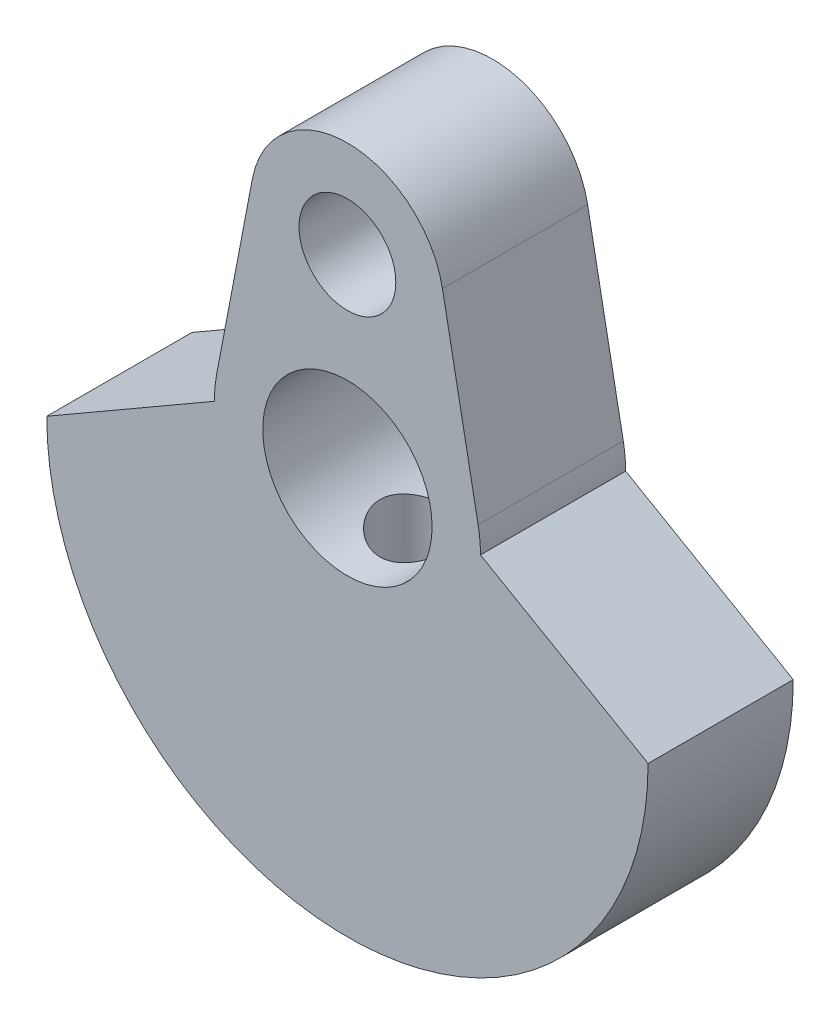
ISO-10303-21;
HEADER;
FILE_DESCRIPTION(('STEP AP214'),'2;1');
FILE_NAME('part.step','',(''),(''),'','','');
FILE_SCHEMA(('AUTOMOTIVE_DESIGN { 1 0 10303 214 1 1 1 1 }'));
ENDSEC;
DATA;
#1=APPLICATION_CONTEXT('core data for automotive mechanical design processes');
#2=APPLICATION_PROTOCOL_DEFINITION('international standard','automotive_design',2000,#1);
#3=PRODUCT_CONTEXT('',#1,'mechanical');
#4=PRODUCT('Part','Part','',(#3));
#5=PRODUCT_RELATED_PRODUCT_CATEGORY('part','',(#4));
#6=PRODUCT_DEFINITION_FORMATION('','',#4);
#7=PRODUCT_DEFINITION_CONTEXT('part definition',#1,'design');
#8=PRODUCT_DEFINITION('design','',#6,#7);
#9=PRODUCT_DEFINITION_SHAPE('','',#8);
#10=(LENGTH_UNIT() NAMED_UNIT(*) SI_UNIT(.MILLI.,.METRE.));
#11=(NAMED_UNIT(*) PLANE_ANGLE_UNIT() SI_UNIT($,.RADIAN.));
#12=(NAMED_UNIT(*) SI_UNIT($,.STERADIAN.) SOLID_ANGLE_UNIT());
#13=UNCERTAINTY_MEASURE_WITH_UNIT(LENGTH_MEASURE(1.E-05),#10,'distance_accuracy_value','');
#14=(GEOMETRIC_REPRESENTATION_CONTEXT(3) GLOBAL_UNCERTAINTY_ASSIGNED_CONTEXT((#13)) GLOBAL_UNIT_ASSIGNED_CONTEXT((#10,
#11,#12)) REPRESENTATION_CONTEXT('',''));
#15=CARTESIAN_POINT('',(0.,0.,0.));
#16=DIRECTION('',(0.,0.,1.));
#17=DIRECTION('',(1.,0.,0.));
#18=AXIS2_PLACEMENT_3D('',#15,#16,#17);
#19=CARTESIAN_POINT('',(0.,0.,3.));
#20=DIRECTION('',(0.,0.,-1.));
#21=DIRECTION('',(-1.,0.,0.));
#22=AXIS2_PLACEMENT_3D('',#19,#20,#21);
#23=CYLINDRICAL_SURFACE('',#22,5.5);
#24=DIRECTION('',(0.,0.,-1.));
#25=VECTOR('',#24,1.);
#26=CARTESIAN_POINT('',(5.40245531564121,1.03125,3.));
#27=LINE('',#26,#25);
#28=CARTESIAN_POINT('',(5.40245531564121,1.03125,3.));
#29=VERTEX_POINT('',#28);
#30=CARTESIAN_POINT('',(5.40245531564121,1.03125,-3.));
#31=VERTEX_POINT('',#30);
#32=EDGE_CURVE('E74',#29,#31,#27,.T.);
#33=ORIENTED_EDGE('',*,*,#32,.F.);
#34=CARTESIAN_POINT('',(0.,0.,3.));
#35=DIRECTION('',(0.,0.,1.));
#36=DIRECTION('',(1.,0.,0.));
#37=AXIS2_PLACEMENT_3D('',#34,#35,#36);
#38=CIRCLE('',#37,5.5);
#39=CARTESIAN_POINT('',(5.5,0.,3.));
#40=VERTEX_POINT('',#39);
#41=EDGE_CURVE('E135',#40,#29,#38,.T.);
#42=ORIENTED_EDGE('',*,*,#41,.F.);
#43=DIRECTION('',(0.,0.,-1.));
#44=VECTOR('',#43,1.);
#45=CARTESIAN_POINT('',(5.5,0.,3.));
#46=LINE('',#45,#44);
#47=CARTESIAN_POINT('',(5.5,0.,-3.));
#48=VERTEX_POINT('',#47);
#49=EDGE_CURVE('E166',#40,#48,#46,.T.);
#50=ORIENTED_EDGE('',*,*,#49,.T.);
#51=CARTESIAN_POINT('',(0.,0.,-3.));
#52=DIRECTION('',(0.,0.,1.));
#53=DIRECTION('',(1.,0.,0.));
#54=AXIS2_PLACEMENT_3D('',#51,#52,#53);
#55=CIRCLE('',#54,5.5);
#56=EDGE_CURVE('E154',#48,#31,#55,.T.);
#57=ORIENTED_EDGE('',*,*,#56,.T.);
#58=EDGE_LOOP('',(#33,#42,#50,#57));
#59=FACE_BOUND('',#58,.T.);
#60=ADVANCED_FACE('F51',(#59),#23,.T.);
#61=CARTESIAN_POINT('',(-1.37499999999997,2.38156986040719,3.));
#62=DIRECTION('',(0.499999999999995,-0.866025403784441,0.));
#63=DIRECTION('',(0.866025403784442,0.499999999999995,0.));
#64=AXIS2_PLACEMENT_3D('',#61,#62,#63);
#65=PLANE('',#64);
#66=DIRECTION('',(-0.866025403784442,-0.499999999999995,0.));
#67=VECTOR('',#66,1.);
#68=CARTESIAN_POINT('',(-1.37499999999997,2.38156986040719,-3.));
#69=LINE('',#68,#67);
#70=CARTESIAN_POINT('',(-5.5,0.,-3.));
#71=VERTEX_POINT('',#70);
#72=CARTESIAN_POINT('',(-12.4282032302756,-4.,-3.));
#73=VERTEX_POINT('',#72);
#74=EDGE_CURVE('E155',#71,#73,#69,.T.);
#75=ORIENTED_EDGE('',*,*,#74,.T.);
#76=DIRECTION('',(0.,0.,-1.));
#77=VECTOR('',#76,1.);
#78=CARTESIAN_POINT('',(-12.4282032302756,-4.,3.));
#79=LINE('',#78,#77);
#80=CARTESIAN_POINT('',(-12.4282032302756,-4.,3.));
#81=VERTEX_POINT('',#80);
#82=EDGE_CURVE('E59',#81,#73,#79,.T.);
#83=ORIENTED_EDGE('',*,*,#82,.F.);
#84=DIRECTION('',(-0.866025403784442,-0.499999999999995,0.));
#85=VECTOR('',#84,1.);
#86=CARTESIAN_POINT('',(-1.37499999999997,2.38156986040719,3.));
#87=LINE('',#86,#85);
#88=CARTESIAN_POINT('',(-5.5,0.,3.));
#89=VERTEX_POINT('',#88);
#90=EDGE_CURVE('E158',#89,#81,#87,.T.);
#91=ORIENTED_EDGE('',*,*,#90,.F.);
#92=DIRECTION('',(0.,0.,-1.));
#93=VECTOR('',#92,1.);
#94=CARTESIAN_POINT('',(-5.5,0.,3.));
#95=LINE('',#94,#93);
#96=EDGE_CURVE('E11',#89,#71,#95,.T.);
#97=ORIENTED_EDGE('',*,*,#96,.T.);
#98=EDGE_LOOP('',(#75,#83,#91,#97));
#99=FACE_BOUND('',#98,.T.);
#100=ADVANCED_FACE('F53',(#99),#65,.F.);
#101=CARTESIAN_POINT('',(0.,-4.,3.));
#102=DIRECTION('',(0.,0.,-1.));
#103=DIRECTION('',(-1.,0.,0.));
#104=AXIS2_PLACEMENT_3D('',#101,#102,#103);
#105=CYLINDRICAL_SURFACE('',#104,12.4282032302755);
#106=CARTESIAN_POINT('',(0.,-16.4282032302755,-1.65));
#107=CARTESIAN_POINT('',(-0.0922460140862746,-16.4282018796383,-1.6499961119085));
#108=CARTESIAN_POINT('',(-0.184548475318026,-16.4271653897039,-1.64223815518213));
#109=CARTESIAN_POINT('',(-0.366581574777021,-16.4231303398548,-1.61141451439762));
#110=CARTESIAN_POINT('',(-0.456309482176113,-16.4201297715156,-1.58833316061842));
#111=CARTESIAN_POINT('',(-0.63053208554563,-16.4125043525537,-1.52755762931133));
#112=CARTESIAN_POINT('',(-0.715030383446372,-16.407880634867,-1.48987364232215));
#113=CARTESIAN_POINT('',(-0.876488581604952,-16.3975221942178,-1.40098563884094));
#114=CARTESIAN_POINT('',(-0.953449699983536,-16.3917876512287,-1.34978381199344));
#115=CARTESIAN_POINT('',(-1.09813961200789,-16.379807446442,-1.23497566375453));
#116=CARTESIAN_POINT('',(-1.16581510006422,-16.3735591380857,-1.17130243190006));
#117=CARTESIAN_POINT('',(-1.28955335403599,-16.3612767800193,-1.03350271927866));
#118=CARTESIAN_POINT('',(-1.34561550691324,-16.3552427416339,-0.959375687029383));
#119=CARTESIAN_POINT('',(-1.44473700590495,-16.3440462176461,-0.802422534540132));
#120=CARTESIAN_POINT('',(-1.48774591043379,-16.3388871462005,-0.719564294067664));
#121=CARTESIAN_POINT('',(-1.55921785830803,-16.3300600128264,-0.547720911422881));
#122=CARTESIAN_POINT('',(-1.58768152273866,-16.3263918872356,-0.458736031043705));
#123=CARTESIAN_POINT('',(-1.62909192481638,-16.3209875004582,-0.277720952398265));
#124=CARTESIAN_POINT('',(-1.64212907293452,-16.3192399874427,-0.185711778999442));
#125=CARTESIAN_POINT('',(-1.65259622180176,-16.3178403465541,-0.000796216248094434));
#126=CARTESIAN_POINT('',(-1.65002692798819,-16.3181881239704,0.0921101323610789));
#127=CARTESIAN_POINT('',(-1.6294282437271,-16.3209294729807,0.27555020569896));
#128=CARTESIAN_POINT('',(-1.61149876309415,-16.3233098234455,0.366095375177008));
#129=CARTESIAN_POINT('',(-1.56084469113325,-16.3298274850952,0.542880426727257));
#130=CARTESIAN_POINT('',(-1.52811976510884,-16.3339648360261,0.629120211355808));
#131=CARTESIAN_POINT('',(-1.44869737327961,-16.3435452049367,0.795154975646927));
#132=CARTESIAN_POINT('',(-1.4019568119872,-16.3489922395648,0.874929099440617));
#133=CARTESIAN_POINT('',(-1.29586073017348,-16.3605751918355,1.02553939787928));
#134=CARTESIAN_POINT('',(-1.23650455925895,-16.3667111449874,1.09637511140754));
#135=CARTESIAN_POINT('',(-1.10630999629647,-16.3790392415273,1.22767748419));
#136=CARTESIAN_POINT('',(-1.03538554940491,-16.3852314494948,1.28805884130705));
#137=CARTESIAN_POINT('',(-0.884363137161576,-16.3969296168043,1.39607323078391));
#138=CARTESIAN_POINT('',(-0.804265145777201,-16.4024355741988,1.44370622696524));
#139=CARTESIAN_POINT('',(-0.637101173994518,-16.4121449231365,1.52487308528783));
#140=CARTESIAN_POINT('',(-0.550032392406724,-16.4163477876968,1.55840124525267));
#141=CARTESIAN_POINT('',(-0.371432354676754,-16.4229727515999,1.61033710304846));
#142=CARTESIAN_POINT('',(-0.279901334659237,-16.4253949450601,1.62874560003634));
#143=CARTESIAN_POINT('',(-0.0957122166202344,-16.4281733519611,1.64980818860451));
#144=CARTESIAN_POINT('',(-0.00306777136873621,-16.4285449654286,1.65257971865799));
#145=CARTESIAN_POINT('',(0.181364337289116,-16.42722202066,1.64260014511233));
#146=CARTESIAN_POINT('',(0.273152021283276,-16.4255275122018,1.62984941548271));
#147=CARTESIAN_POINT('',(0.452915885018917,-16.420272285747,1.58928486386035));
#148=CARTESIAN_POINT('',(0.540905002505106,-16.4167185510056,1.56152739426004));
#149=CARTESIAN_POINT('',(0.710979766732933,-16.4081425092078,1.49179612685811));
#150=CARTESIAN_POINT('',(0.793065189809997,-16.4031201465481,1.4498217907866));
#151=CARTESIAN_POINT('',(0.949524604941959,-16.3921278506302,1.35256667085591));
#152=CARTESIAN_POINT('',(1.02385126214579,-16.386152606104,1.29721034776865));
#153=CARTESIAN_POINT('',(1.1622008361635,-16.3739386368724,1.17486898419918));
#154=CARTESIAN_POINT('',(1.22622328912438,-16.3676999003217,1.10788342049827));
#155=CARTESIAN_POINT('',(1.34256688494111,-16.3556141865856,0.963666093101858));
#156=CARTESIAN_POINT('',(1.39480991844275,-16.3497699947551,0.88637104884709));
#157=CARTESIAN_POINT('',(1.48557111454818,-16.3391819320872,0.724034212201595));
#158=CARTESIAN_POINT('',(1.52408958146364,-16.3344380368541,0.638992591626442));
#159=CARTESIAN_POINT('',(1.58618335072867,-16.3266070421279,0.46382306066769));
#160=CARTESIAN_POINT('',(1.60980183322584,-16.3235151591272,0.373710679763353));
#161=CARTESIAN_POINT('',(1.64156380897731,-16.3193248478809,0.190754962067151));
#162=CARTESIAN_POINT('',(1.64970812232409,-16.3182263139928,0.0979117702663071));
#163=CARTESIAN_POINT('',(1.65027422105732,-16.3181504220044,-0.0870926285835566));
#164=CARTESIAN_POINT('',(1.64281874119814,-16.3191565053568,-0.179253477182541));
#165=CARTESIAN_POINT('',(1.61265769824293,-16.3231407759284,-0.360999382361834));
#166=CARTESIAN_POINT('',(1.58995214031877,-16.3261189624788,-0.45058443981568));
#167=CARTESIAN_POINT('',(1.529975346423,-16.333706556289,-0.624614369084146));
#168=CARTESIAN_POINT('',(1.49271080995529,-16.3383152131745,-0.709061584516537));
#169=CARTESIAN_POINT('',(1.40468592376755,-16.3486456024356,-0.870524490200793));
#170=CARTESIAN_POINT('',(1.35392531987586,-16.3543673557735,-0.947540040454746));
#171=CARTESIAN_POINT('',(1.23989646240463,-16.3663330942686,-1.09257981952642));
#172=CARTESIAN_POINT('',(1.1765368676886,-16.3725806887656,-1.1605319451115));
#173=CARTESIAN_POINT('',(1.03930035594545,-16.3848627884164,-1.2848852786681));
#174=CARTESIAN_POINT('',(0.965420974318123,-16.3908972432206,-1.34128377225539));
#175=CARTESIAN_POINT('',(0.808875687663168,-16.4021020420171,-1.44113811092125));
#176=CARTESIAN_POINT('',(0.726173503816966,-16.4072685741702,-1.48453748577049));
#177=CARTESIAN_POINT('',(0.554630024608526,-16.4161172650048,-1.55676854143241));
#178=CARTESIAN_POINT('',(0.465795426284667,-16.4198010138651,-1.58561583676399));
#179=CARTESIAN_POINT('',(0.313765207082695,-16.4243946960043,-1.62112301226786));
#180=CARTESIAN_POINT('',(0.251522810892734,-16.4258158298004,-1.63193603681607));
#181=CARTESIAN_POINT('',(0.126195745416524,-16.4277205548771,-1.64637582940735));
#182=CARTESIAN_POINT('',(0.0631110834755244,-16.4282041543282,-1.6500026600788));
#183=CARTESIAN_POINT('',(0.,-16.4282032302755,-1.65));
#184=B_SPLINE_CURVE_WITH_KNOTS('',3,(#106,#107,#108,#109,#110,#111,#112,#113,#114,#115,#116,
#117,#118,#119,#120,#121,#122,#123,#124,#125,#126,#127,#128,#129,#130,#131,#132,#133,#134,#135,
#136,#137,#138,#139,#140,#141,#142,#143,#144,#145,#146,#147,#148,#149,#150,#151,#152,#153,#154,
#155,#156,#157,#158,#159,#160,#161,#162,#163,#164,#165,#166,#167,#168,#169,#170,#171,#172,#173,
#174,#175,#176,#177,#178,#179,#180,#181,#182,#183),.UNSPECIFIED.,.T.,.F.,(4,2,2,2,2,2,2,2,2,2,2,
2,2,2,2,2,2,2,2,2,2,2,2,2,2,2,2,2,2,2,2,2,2,2,2,2,2,2,4),(0.,0.276507491943262,
0.553298177158618,0.829896049124192,1.10644914471831,1.38452876185406,1.66262305436132,
1.94177868940153,2.22092240343299,2.49842190147762,2.77590885617326,3.05160449223302,
3.32730636527789,3.60386481831088,3.88043753267559,4.15917025875473,4.43790377583888,
4.71674986876843,4.99558122220724,5.27231564942836,5.54904340956645,5.82473916395728,
6.10044535773109,6.37774578391588,6.6550586895387,6.93415965263849,7.21325442691119,
7.49153662360248,7.76980407161828,8.04589042511766,8.32197668498577,8.5979360495119,
8.87390061155368,9.15194404935517,9.43005273532881,9.70935260817428,9.98835214873004,
10.1775293144312,10.366704831428),.UNSPECIFIED.);
#185=CARTESIAN_POINT('',(0.,-16.4282032302755,-1.65));
#186=VERTEX_POINT('',#185);
#187=EDGE_CURVE('E209',#186,#186,#184,.T.);
#188=ORIENTED_EDGE('',*,*,#187,.T.);
#189=EDGE_LOOP('',(#188));
#190=FACE_BOUND('',#189,.T.);
#191=CARTESIAN_POINT('',(0.,-4.,-3.));
#192=DIRECTION('',(0.,0.,1.));
#193=DIRECTION('',(1.,0.,0.));
#194=AXIS2_PLACEMENT_3D('',#191,#192,#193);
#195=CIRCLE('',#194,12.4282032302755);
#196=CARTESIAN_POINT('',(12.4282032302755,-4.,-3.));
#197=VERTEX_POINT('',#196);
#198=EDGE_CURVE('E168',#73,#197,#195,.T.);
#199=ORIENTED_EDGE('',*,*,#198,.T.);
#200=DIRECTION('',(0.,0.,-1.));
#201=VECTOR('',#200,1.);
#202=CARTESIAN_POINT('',(12.4282032302755,-4.,3.));
#203=LINE('',#202,#201);
#204=CARTESIAN_POINT('',(12.4282032302755,-4.,3.));
#205=VERTEX_POINT('',#204);
#206=EDGE_CURVE('E175',#205,#197,#203,.T.);
#207=ORIENTED_EDGE('',*,*,#206,.F.);
#208=CARTESIAN_POINT('',(0.,-4.,3.));
#209=DIRECTION('',(0.,0.,1.));
#210=DIRECTION('',(1.,0.,0.));
#211=AXIS2_PLACEMENT_3D('',#208,#209,#210);
#212=CIRCLE('',#211,12.4282032302755);
#213=EDGE_CURVE('E160',#81,#205,#212,.T.);
#214=ORIENTED_EDGE('',*,*,#213,.F.);
#215=ORIENTED_EDGE('',*,*,#82,.T.);
#216=EDGE_LOOP('',(#199,#207,#214,#215));
#217=FACE_BOUND('',#216,.T.);
#218=ADVANCED_FACE('F181',(#190,#217),#105,.T.);
#219=CARTESIAN_POINT('',(1.37500000000001,2.38156986040721,3.));
#220=DIRECTION('',(0.500000000000001,0.866025403784438,0.));
#221=DIRECTION('',(-0.866025403784438,0.500000000000001,0.));
#222=AXIS2_PLACEMENT_3D('',#219,#220,#221);
#223=PLANE('',#222);
#224=DIRECTION('',(0.866025403784438,-0.500000000000001,0.));
#225=VECTOR('',#224,1.);
#226=CARTESIAN_POINT('',(1.37500000000001,2.38156986040721,-3.));
#227=LINE('',#226,#225);
#228=EDGE_CURVE('E161',#48,#197,#227,.T.);
#229=ORIENTED_EDGE('',*,*,#228,.F.);
#230=ORIENTED_EDGE('',*,*,#49,.F.);
#231=DIRECTION('',(0.866025403784438,-0.500000000000001,0.));
#232=VECTOR('',#231,1.);
#233=CARTESIAN_POINT('',(1.37500000000001,2.38156986040721,3.));
#234=LINE('',#233,#232);
#235=EDGE_CURVE('E163',#40,#205,#234,.T.);
#236=ORIENTED_EDGE('',*,*,#235,.T.);
#237=ORIENTED_EDGE('',*,*,#206,.T.);
#238=EDGE_LOOP('',(#229,#230,#236,#237));
#239=FACE_BOUND('',#238,.T.);
#240=ADVANCED_FACE('F192',(#239),#223,.T.);
#241=CARTESIAN_POINT('',(0.,0.,3.));
#242=DIRECTION('',(0.,0.,1.));
#243=DIRECTION('',(1.,0.,0.));
#244=AXIS2_PLACEMENT_3D('',#241,#242,#243);
#245=PLANE('',#244);
#246=ORIENTED_EDGE('',*,*,#235,.F.);
#247=ORIENTED_EDGE('',*,*,#41,.T.);
#248=DIRECTION('',(-0.1875,0.982264602843857,0.));
#249=VECTOR('',#248,1.);
#250=CARTESIAN_POINT('',(5.40245531564121,1.03125,3.));
#251=LINE('',#250,#249);
#252=CARTESIAN_POINT('',(3.92905841137543,8.75,3.));
#253=VERTEX_POINT('',#252);
#254=EDGE_CURVE('E129',#29,#253,#251,.T.);
#255=ORIENTED_EDGE('',*,*,#254,.T.);
#256=CARTESIAN_POINT('',(0.,8.,3.));
#257=DIRECTION('',(0.,0.,1.));
#258=DIRECTION('',(1.,0.,0.));
#259=AXIS2_PLACEMENT_3D('',#256,#257,#258);
#260=CIRCLE('',#259,4.);
#261=CARTESIAN_POINT('',(-3.92905841137543,8.75,3.));
#262=VERTEX_POINT('',#261);
#263=EDGE_CURVE('E117',#253,#262,#260,.T.);
#264=ORIENTED_EDGE('',*,*,#263,.T.);
#265=DIRECTION('',(0.1875,0.982264602843857,0.));
#266=VECTOR('',#265,1.);
#267=CARTESIAN_POINT('',(-5.40245531564122,1.03125,3.));
#268=LINE('',#267,#266);
#269=CARTESIAN_POINT('',(-5.40245531564121,1.03125,3.));
#270=VERTEX_POINT('',#269);
#271=EDGE_CURVE('E128',#270,#262,#268,.T.);
#272=ORIENTED_EDGE('',*,*,#271,.F.);
#273=EDGE_CURVE('E66',#270,#89,#38,.T.);
#274=ORIENTED_EDGE('',*,*,#273,.T.);
#275=ORIENTED_EDGE('',*,*,#90,.T.);
#276=ORIENTED_EDGE('',*,*,#213,.T.);
#277=EDGE_LOOP('',(#246,#247,#255,#264,#272,#274,#275,#276));
#278=FACE_BOUND('',#277,.T.);
#279=CARTESIAN_POINT('',(0.,0.,3.));
#280=DIRECTION('',(0.,0.,1.));
#281=DIRECTION('',(1.,0.,0.));
#282=AXIS2_PLACEMENT_3D('',#279,#280,#281);
#283=CIRCLE('',#282,3.5);
#284=CARTESIAN_POINT('',(3.5,0.,3.));
#285=VERTEX_POINT('',#284);
#286=EDGE_CURVE('E151',#285,#285,#283,.T.);
#287=ORIENTED_EDGE('',*,*,#286,.F.);
#288=EDGE_LOOP('',(#287));
#289=FACE_BOUND('',#288,.T.);
#290=CARTESIAN_POINT('',(0.,8.,3.));
#291=DIRECTION('',(0.,0.,1.));
#292=DIRECTION('',(1.,0.,0.));
#293=AXIS2_PLACEMENT_3D('',#290,#291,#292);
#294=CIRCLE('',#293,2.);
#295=CARTESIAN_POINT('',(2.,8.,3.));
#296=VERTEX_POINT('',#295);
#297=EDGE_CURVE('E137',#296,#296,#294,.T.);
#298=ORIENTED_EDGE('',*,*,#297,.F.);
#299=EDGE_LOOP('',(#298));
#300=FACE_BOUND('',#299,.T.);
#301=ADVANCED_FACE('F133',(#278,#289,#300),#245,.T.);
#302=CARTESIAN_POINT('',(0.,0.,-3.));
#303=DIRECTION('',(0.,0.,1.));
#304=DIRECTION('',(1.,0.,0.));
#305=AXIS2_PLACEMENT_3D('',#302,#303,#304);
#306=PLANE('',#305);
#307=ORIENTED_EDGE('',*,*,#74,.F.);
#308=CARTESIAN_POINT('',(-5.40245531564122,1.03125,-3.));
#309=VERTEX_POINT('',#308);
#310=EDGE_CURVE('E145',#309,#71,#55,.T.);
#311=ORIENTED_EDGE('',*,*,#310,.F.);
#312=DIRECTION('',(0.1875,0.982264602843857,0.));
#313=VECTOR('',#312,1.);
#314=CARTESIAN_POINT('',(-5.40245531564122,1.03125,-3.));
#315=LINE('',#314,#313);
#316=CARTESIAN_POINT('',(-3.92905841137543,8.75,-3.));
#317=VERTEX_POINT('',#316);
#318=EDGE_CURVE('E196',#309,#317,#315,.T.);
#319=ORIENTED_EDGE('',*,*,#318,.T.);
#320=CARTESIAN_POINT('',(0.,8.,-3.));
#321=DIRECTION('',(0.,0.,1.));
#322=DIRECTION('',(1.,0.,0.));
#323=AXIS2_PLACEMENT_3D('',#320,#321,#322);
#324=CIRCLE('',#323,4.);
#325=CARTESIAN_POINT('',(3.92905841137543,8.75,-3.));
#326=VERTEX_POINT('',#325);
#327=EDGE_CURVE('E197',#326,#317,#324,.T.);
#328=ORIENTED_EDGE('',*,*,#327,.F.);
#329=DIRECTION('',(-0.1875,0.982264602843857,0.));
#330=VECTOR('',#329,1.);
#331=CARTESIAN_POINT('',(5.40245531564121,1.03125,-3.));
#332=LINE('',#331,#330);
#333=EDGE_CURVE('E141',#31,#326,#332,.T.);
#334=ORIENTED_EDGE('',*,*,#333,.F.);
#335=ORIENTED_EDGE('',*,*,#56,.F.);
#336=ORIENTED_EDGE('',*,*,#228,.T.);
#337=ORIENTED_EDGE('',*,*,#198,.F.);
#338=EDGE_LOOP('',(#307,#311,#319,#328,#334,#335,#336,#337));
#339=FACE_BOUND('',#338,.T.);
#340=CARTESIAN_POINT('',(0.,0.,-3.));
#341=DIRECTION('',(0.,0.,1.));
#342=DIRECTION('',(1.,0.,0.));
#343=AXIS2_PLACEMENT_3D('',#340,#341,#342);
#344=CIRCLE('',#343,3.5);
#345=CARTESIAN_POINT('',(3.5,0.,-3.));
#346=VERTEX_POINT('',#345);
#347=EDGE_CURVE('E142',#346,#346,#344,.T.);
#348=ORIENTED_EDGE('',*,*,#347,.T.);
#349=EDGE_LOOP('',(#348));
#350=FACE_BOUND('',#349,.T.);
#351=CARTESIAN_POINT('',(0.,8.,-3.));
#352=DIRECTION('',(0.,0.,1.));
#353=DIRECTION('',(1.,0.,0.));
#354=AXIS2_PLACEMENT_3D('',#351,#352,#353);
#355=CIRCLE('',#354,2.);
#356=CARTESIAN_POINT('',(2.,8.,-3.));
#357=VERTEX_POINT('',#356);
#358=EDGE_CURVE('E207',#357,#357,#355,.T.);
#359=ORIENTED_EDGE('',*,*,#358,.T.);
#360=EDGE_LOOP('',(#359));
#361=FACE_BOUND('',#360,.T.);
#362=ADVANCED_FACE('F187',(#339,#350,#361),#306,.F.);
#363=ORIENTED_EDGE('',*,*,#273,.F.);
#364=DIRECTION('',(0.,0.,-1.));
#365=VECTOR('',#364,1.);
#366=CARTESIAN_POINT('',(-5.40245531564122,1.03125,3.));
#367=LINE('',#366,#365);
#368=EDGE_CURVE('E147',#270,#309,#367,.T.);
#369=ORIENTED_EDGE('',*,*,#368,.T.);
#370=ORIENTED_EDGE('',*,*,#310,.T.);
#371=ORIENTED_EDGE('',*,*,#96,.F.);
#372=EDGE_LOOP('',(#363,#369,#370,#371));
#373=FACE_BOUND('',#372,.T.);
#374=ADVANCED_FACE('F193',(#373),#23,.T.);
#375=CARTESIAN_POINT('',(0.,0.,3.));
#376=DIRECTION('',(0.,0.,-1.));
#377=DIRECTION('',(-1.,0.,0.));
#378=AXIS2_PLACEMENT_3D('',#375,#376,#377);
#379=CYLINDRICAL_SURFACE('',#378,3.5);
#380=CARTESIAN_POINT('',(0.,-3.5,-1.65));
#381=CARTESIAN_POINT('',(-0.0873268279377622,-3.49999586738243,-1.64999510373431));
#382=CARTESIAN_POINT('',(-0.174775003472294,-3.49669585660961,-1.64302645184735));
#383=CARTESIAN_POINT('',(-0.34712342051079,-3.48382147200558,-1.61544284332315));
#384=CARTESIAN_POINT('',(-0.432017706825884,-3.4742334675849,-1.5947982401117));
#385=CARTESIAN_POINT('',(-0.596495907740236,-3.44979425001382,-1.54082926625743));
#386=CARTESIAN_POINT('',(-0.676098344376043,-3.43496268285988,-1.5075521916872));
#387=CARTESIAN_POINT('',(-0.828489801176206,-3.40142631352532,-1.42948960407102));
#388=CARTESIAN_POINT('',(-0.901279873647178,-3.3827221109897,-1.38470587247574));
#389=CARTESIAN_POINT('',(-1.0425326530751,-3.34197927445039,-1.2820552997365));
#390=CARTESIAN_POINT('',(-1.11053040163451,-3.3198131345596,-1.22359991339426));
#391=CARTESIAN_POINT('',(-1.23617648383679,-3.27510663792719,-1.0965222392037));
#392=CARTESIAN_POINT('',(-1.29381785801479,-3.25256604058118,-1.02789317076516));
#393=CARTESIAN_POINT('',(-1.40096330593765,-3.20794237403987,-0.87688761411639));
#394=CARTESIAN_POINT('',(-1.44966502932557,-3.18599079303621,-0.793898584890233));
#395=CARTESIAN_POINT('',(-1.5322156686568,-3.1471275133361,-0.619744765467777));
#396=CARTESIAN_POINT('',(-1.56607423626943,-3.13021254191828,-0.528585334616729));
#397=CARTESIAN_POINT('',(-1.61593257103069,-3.10475611299989,-0.345979421022447));
#398=CARTESIAN_POINT('',(-1.63283299088157,-3.09579567979913,-0.254839945781534));
#399=CARTESIAN_POINT('',(-1.65107929835659,-3.08610694453758,-0.0706137399238874));
#400=CARTESIAN_POINT('',(-1.65243772525504,-3.08537200616095,0.0224713602036214));
#401=CARTESIAN_POINT('',(-1.64022738774925,-3.09187338895173,0.19763068217));
#402=CARTESIAN_POINT('',(-1.62818686219594,-3.09829371805178,0.279848602527364));
#403=CARTESIAN_POINT('',(-1.59213776607365,-3.11697050036214,0.440921326114741));
#404=CARTESIAN_POINT('',(-1.56812602728039,-3.12922849849391,0.519775233046168));
#405=CARTESIAN_POINT('',(-1.50834869472674,-3.15848201386784,0.674087030510774));
#406=CARTESIAN_POINT('',(-1.47232388676647,-3.17558062785177,0.7494240563363));
#407=CARTESIAN_POINT('',(-1.38973424225791,-3.21258211770392,0.893324637729824));
#408=CARTESIAN_POINT('',(-1.3431647715608,-3.23248622506891,0.961885196100618));
#409=CARTESIAN_POINT('',(-1.23476185583675,-3.27553425648673,1.09830359988061));
#410=CARTESIAN_POINT('',(-1.17180756272316,-3.29879248271025,1.16523764370733));
#411=CARTESIAN_POINT('',(-1.03541627388649,-3.34411071821352,1.28795679149433));
#412=CARTESIAN_POINT('',(-0.96197530478742,-3.36617026892424,1.343737650223));
#413=CARTESIAN_POINT('',(-0.803210922468438,-3.40761196200502,1.44447481097861));
#414=CARTESIAN_POINT('',(-0.717548187821268,-3.42686469917373,1.48895374928325));
#415=CARTESIAN_POINT('',(-0.538815693880734,-3.45946595161841,1.56252946710821));
#416=CARTESIAN_POINT('',(-0.445751240577486,-3.47281865216852,1.59163715331221));
#417=CARTESIAN_POINT('',(-0.262481014855954,-3.4912649006343,1.63147656979133));
#418=CARTESIAN_POINT('',(-0.172599230233146,-3.49691105810484,1.6434413136631));
#419=CARTESIAN_POINT('',(0.00806100007144688,-3.50115490188957,1.65245419098267));
#420=CARTESIAN_POINT('',(0.0988390732290233,-3.49975540289745,1.6495082811366));
#421=CARTESIAN_POINT('',(0.272258269574313,-3.49040346252514,1.62956509855665));
#422=CARTESIAN_POINT('',(0.355036592203248,-3.48289714095271,1.61352418512328));
#423=CARTESIAN_POINT('',(0.516587504601427,-3.4626245410577,1.56928454845822));
#424=CARTESIAN_POINT('',(0.595359628229985,-3.44985765220849,1.54108441404389));
#425=CARTESIAN_POINT('',(0.749407922823944,-3.41975704421134,1.47248603112069));
#426=CARTESIAN_POINT('',(0.824504650131207,-3.4022961235053,1.43174255517083));
#427=CARTESIAN_POINT('',(0.967059749723549,-3.36455669068655,1.33959232310271));
#428=CARTESIAN_POINT('',(1.03451474908349,-3.34427694311964,1.28818088646354));
#429=CARTESIAN_POINT('',(1.16624336689728,-3.30077375801457,1.17082713793909));
#430=CARTESIAN_POINT('',(1.22969440736722,-3.27744919463595,1.10399700178652));
#431=CARTESIAN_POINT('',(1.34480366789696,-3.2319255589124,0.960454418058999));
#432=CARTESIAN_POINT('',(1.39645592002851,-3.20972706053724,0.883736999962999));
#433=CARTESIAN_POINT('',(1.48811445053865,-3.16830219565231,0.719155241044967));
#434=CARTESIAN_POINT('',(1.52765708639659,-3.14920490119098,0.63099749914204));
#435=CARTESIAN_POINT('',(1.59093161547005,-3.11772452710618,0.448078290917354));
#436=CARTESIAN_POINT('',(1.61468143226738,-3.10533383900547,0.353324446083288));
#437=CARTESIAN_POINT('',(1.64370223580338,-3.09006269265966,0.169183556757966));
#438=CARTESIAN_POINT('',(1.65046042900548,-3.08641822939854,0.0800947272942787));
#439=CARTESIAN_POINT('',(1.64949116738446,-3.08693737833869,-0.0979683256975021));
#440=CARTESIAN_POINT('',(1.64176803511748,-3.09109866058947,-0.186942575494027));
#441=CARTESIAN_POINT('',(1.61340307685818,-3.10598654604962,-0.355186840273455));
#442=CARTESIAN_POINT('',(1.5937856233104,-3.11619119995941,-0.434681017565479));
#443=CARTESIAN_POINT('',(1.54335574133227,-3.14147162704019,-0.589205724579435));
#444=CARTESIAN_POINT('',(1.51253995103856,-3.15654886286304,-0.66423490598053));
#445=CARTESIAN_POINT('',(1.43826220216968,-3.19110997973679,-0.81319384378396));
#446=CARTESIAN_POINT('',(1.39409504926621,-3.21082036763064,-0.886718043154171));
#447=CARTESIAN_POINT('',(1.29521645110348,-3.25196569198877,-1.02576820779854));
#448=CARTESIAN_POINT('',(1.24049998455551,-3.27340144685585,-1.09129033987199));
#449=CARTESIAN_POINT('',(1.11542413893337,-3.31823436973912,-1.21948835357478));
#450=CARTESIAN_POINT('',(1.04403296913581,-3.34160555443514,-1.28117197649293));
#451=CARTESIAN_POINT('',(0.891162614922436,-3.3855794477608,-1.39184468029073));
#452=CARTESIAN_POINT('',(0.80967859496704,-3.4061808194238,-1.44082764117875));
#453=CARTESIAN_POINT('',(0.63890574949631,-3.44229372001402,-1.52423618981489));
#454=CARTESIAN_POINT('',(0.549648039966641,-3.45782445739751,-1.55871686138908));
#455=CARTESIAN_POINT('',(0.365794568969738,-3.48205775825637,-1.61176655469565));
#456=CARTESIAN_POINT('',(0.271215494683329,-3.49078051701611,-1.63038265253728));
#457=CARTESIAN_POINT('',(0.146544894254574,-3.49705432215178,-1.64374306358916));
#458=CARTESIAN_POINT('',(0.117300423249609,-3.4981566558607,-1.64608676870308));
#459=CARTESIAN_POINT('',(0.0587085422054088,-3.49963019742884,-1.64921607687376));
#460=CARTESIAN_POINT('',(0.0293611299533236,-3.5000013894736,-1.65000164622827));
#461=CARTESIAN_POINT('',(0.,-3.5,-1.65));
#462=B_SPLINE_CURVE_WITH_KNOTS('',3,(#380,#381,#382,#383,#384,#385,#386,#387,#388,#389,#390,
#391,#392,#393,#394,#395,#396,#397,#398,#399,#400,#401,#402,#403,#404,#405,#406,#407,#408,#409,
#410,#411,#412,#413,#414,#415,#416,#417,#418,#419,#420,#421,#422,#423,#424,#425,#426,#427,#428,
#429,#430,#431,#432,#433,#434,#435,#436,#437,#438,#439,#440,#441,#442,#443,#444,#445,#446,#447,
#448,#449,#450,#451,#452,#453,#454,#455,#456,#457,#458,#459,#460,#461),.UNSPECIFIED.,.T.,.F.,(4,
2,2,2,2,2,2,2,2,2,2,2,2,2,2,2,2,2,2,2,2,2,2,2,2,2,2,2,2,2,2,2,2,2,2,2,2,2,2,2,4),(0.,
0.26186061361208,0.524290751508813,0.785747887475134,1.0471645692388,1.32310205177279,
1.59922427585058,1.89381880925412,2.18822149923866,2.4659964058955,2.74354718803913,
2.99241265550522,3.24134402109566,3.49603770076013,3.75084353073188,4.03394985814707,
4.31716373990994,4.61086583668045,4.90435925593914,5.17545103688843,5.44643452703943,
5.6992303514688,5.95205552293813,6.21257782423227,6.4732146711472,6.75713599598191,
7.04120061421923,7.33507250834052,7.62861030961834,7.89538835948892,8.16208679098921,
8.40855507463429,8.65509741196802,8.91804921821688,9.18112649530594,9.47136458262492,
9.76174226640173,10.0510068287675,10.3394100163834,10.4274511990455,10.5154942860038),.UNSPECIFIED.);
#463=CARTESIAN_POINT('',(0.,-3.5,-1.65));
#464=VERTEX_POINT('',#463);
#465=EDGE_CURVE('E213',#464,#464,#462,.T.);
#466=ORIENTED_EDGE('',*,*,#465,.F.);
#467=EDGE_LOOP('',(#466));
#468=FACE_BOUND('',#467,.T.);
#469=ORIENTED_EDGE('',*,*,#286,.T.);
#470=EDGE_LOOP('',(#469));
#471=FACE_BOUND('',#470,.T.);
#472=ORIENTED_EDGE('',*,*,#347,.F.);
#473=EDGE_LOOP('',(#472));
#474=FACE_BOUND('',#473,.T.);
#475=ADVANCED_FACE('F244',(#468,#471,#474),#379,.F.);
#476=CARTESIAN_POINT('',(5.40245531564121,1.03125,3.));
#477=DIRECTION('',(-0.982264602843857,-0.1875,0.));
#478=DIRECTION('',(0.1875,-0.982264602843857,0.));
#479=AXIS2_PLACEMENT_3D('',#476,#477,#478);
#480=PLANE('',#479);
#481=ORIENTED_EDGE('',*,*,#333,.T.);
#482=DIRECTION('',(0.,0.,-1.));
#483=VECTOR('',#482,1.);
#484=CARTESIAN_POINT('',(3.92905841137543,8.75,3.));
#485=LINE('',#484,#483);
#486=EDGE_CURVE('E122',#253,#326,#485,.T.);
#487=ORIENTED_EDGE('',*,*,#486,.F.);
#488=ORIENTED_EDGE('',*,*,#254,.F.);
#489=ORIENTED_EDGE('',*,*,#32,.T.);
#490=EDGE_LOOP('',(#481,#487,#488,#489));
#491=FACE_BOUND('',#490,.T.);
#492=ADVANCED_FACE('F139',(#491),#480,.F.);
#493=CARTESIAN_POINT('',(0.,8.,3.));
#494=DIRECTION('',(0.,0.,-1.));
#495=DIRECTION('',(-1.,0.,0.));
#496=AXIS2_PLACEMENT_3D('',#493,#494,#495);
#497=CYLINDRICAL_SURFACE('',#496,4.);
#498=ORIENTED_EDGE('',*,*,#327,.T.);
#499=DIRECTION('',(0.,0.,-1.));
#500=VECTOR('',#499,1.);
#501=CARTESIAN_POINT('',(-3.92905841137543,8.75,3.));
#502=LINE('',#501,#500);
#503=EDGE_CURVE('E124',#262,#317,#502,.T.);
#504=ORIENTED_EDGE('',*,*,#503,.F.);
#505=ORIENTED_EDGE('',*,*,#263,.F.);
#506=ORIENTED_EDGE('',*,*,#486,.T.);
#507=EDGE_LOOP('',(#498,#504,#505,#506));
#508=FACE_BOUND('',#507,.T.);
#509=ADVANCED_FACE('F120',(#508),#497,.T.);
#510=CARTESIAN_POINT('',(-5.40245531564122,1.03125,3.));
#511=DIRECTION('',(-0.982264602843857,0.1875,0.));
#512=DIRECTION('',(-0.1875,-0.982264602843857,0.));
#513=AXIS2_PLACEMENT_3D('',#510,#511,#512);
#514=PLANE('',#513);
#515=ORIENTED_EDGE('',*,*,#318,.F.);
#516=ORIENTED_EDGE('',*,*,#368,.F.);
#517=ORIENTED_EDGE('',*,*,#271,.T.);
#518=ORIENTED_EDGE('',*,*,#503,.T.);
#519=EDGE_LOOP('',(#515,#516,#517,#518));
#520=FACE_BOUND('',#519,.T.);
#521=ADVANCED_FACE('F237',(#520),#514,.T.);
#522=CARTESIAN_POINT('',(0.,8.,3.));
#523=DIRECTION('',(0.,0.,-1.));
#524=DIRECTION('',(-1.,0.,0.));
#525=AXIS2_PLACEMENT_3D('',#522,#523,#524);
#526=CYLINDRICAL_SURFACE('',#525,2.);
#527=ORIENTED_EDGE('',*,*,#297,.T.);
#528=EDGE_LOOP('',(#527));
#529=FACE_BOUND('',#528,.T.);
#530=ORIENTED_EDGE('',*,*,#358,.F.);
#531=EDGE_LOOP('',(#530));
#532=FACE_BOUND('',#531,.T.);
#533=ADVANCED_FACE('F232',(#529,#532),#526,.F.);
#534=CARTESIAN_POINT('',(0.,-16.4282032302755,0.));
#535=DIRECTION('',(0.,-1.,0.));
#536=DIRECTION('',(0.,0.,-1.));
#537=AXIS2_PLACEMENT_3D('',#534,#535,#536);
#538=CYLINDRICAL_SURFACE('',#537,1.65);
#539=ORIENTED_EDGE('',*,*,#465,.T.);
#540=EDGE_LOOP('',(#539));
#541=FACE_BOUND('',#540,.T.);
#542=ORIENTED_EDGE('',*,*,#187,.F.);
#543=EDGE_LOOP('',(#542));
#544=FACE_BOUND('',#543,.T.);
#545=ADVANCED_FACE('F229',(#541,#544),#538,.F.);
#546=CLOSED_SHELL('',(#60,#100,#218,#240,#301,#362,#374,#475,#492,#509,#521,#533,#545));
#547=MANIFOLD_SOLID_BREP('B2',#546);
#548=ADVANCED_BREP_SHAPE_REPRESENTATION('',(#18,#547),#14);
#549=SHAPE_DEFINITION_REPRESENTATION(#9,#548);
ENDSEC;
END-ISO-10303-21;
